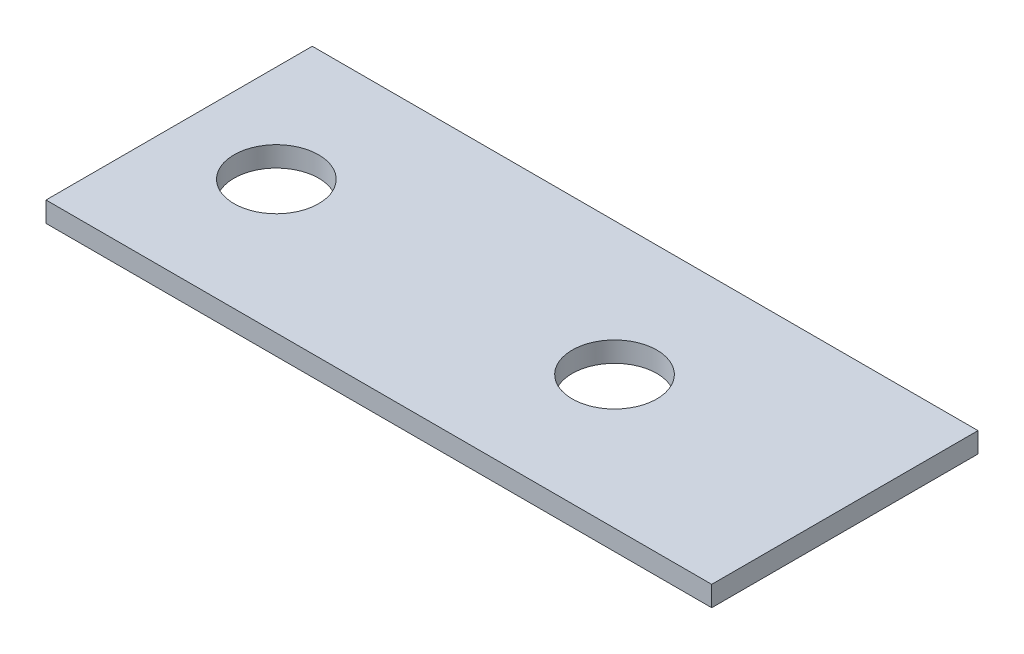
ISO-10303-21;
HEADER;
FILE_DESCRIPTION(('STEP AP214'),'2;1');
FILE_NAME('part.step','',(''),(''),'','','');
FILE_SCHEMA(('AUTOMOTIVE_DESIGN { 1 0 10303 214 1 1 1 1 }'));
ENDSEC;
DATA;
#1=APPLICATION_CONTEXT('core data for automotive mechanical design processes');
#2=APPLICATION_PROTOCOL_DEFINITION('international standard','automotive_design',2000,#1);
#3=PRODUCT_CONTEXT('',#1,'mechanical');
#4=PRODUCT('Part','Part','',(#3));
#5=PRODUCT_RELATED_PRODUCT_CATEGORY('part','',(#4));
#6=PRODUCT_DEFINITION_FORMATION('','',#4);
#7=PRODUCT_DEFINITION_CONTEXT('part definition',#1,'design');
#8=PRODUCT_DEFINITION('design','',#6,#7);
#9=PRODUCT_DEFINITION_SHAPE('','',#8);
#10=(LENGTH_UNIT() NAMED_UNIT(*) SI_UNIT(.MILLI.,.METRE.));
#11=(NAMED_UNIT(*) PLANE_ANGLE_UNIT() SI_UNIT($,.RADIAN.));
#12=(NAMED_UNIT(*) SI_UNIT($,.STERADIAN.) SOLID_ANGLE_UNIT());
#13=UNCERTAINTY_MEASURE_WITH_UNIT(LENGTH_MEASURE(1.E-05),#10,'distance_accuracy_value','');
#14=(GEOMETRIC_REPRESENTATION_CONTEXT(3) GLOBAL_UNCERTAINTY_ASSIGNED_CONTEXT((#13)) GLOBAL_UNIT_ASSIGNED_CONTEXT((#10,
#11,#12)) REPRESENTATION_CONTEXT('',''));
#15=CARTESIAN_POINT('',(0.,0.,0.));
#16=DIRECTION('',(0.,0.,1.));
#17=DIRECTION('',(1.,0.,0.));
#18=AXIS2_PLACEMENT_3D('',#15,#16,#17);
#19=CARTESIAN_POINT('',(21.35,0.762,0.));
#20=DIRECTION('',(1.,0.,0.));
#21=DIRECTION('',(0.,0.,-1.));
#22=AXIS2_PLACEMENT_3D('',#19,#20,#21);
#23=PLANE('',#22);
#24=DIRECTION('',(0.,0.,1.));
#25=VECTOR('',#24,1.);
#26=CARTESIAN_POINT('',(21.35,0.,0.));
#27=LINE('',#26,#25);
#28=CARTESIAN_POINT('',(21.35,0.,-5.));
#29=VERTEX_POINT('',#28);
#30=CARTESIAN_POINT('',(21.35,0.,5.));
#31=VERTEX_POINT('',#30);
#32=EDGE_CURVE('E113',#29,#31,#27,.T.);
#33=ORIENTED_EDGE('',*,*,#32,.F.);
#34=DIRECTION('',(0.,-1.,0.));
#35=VECTOR('',#34,1.);
#36=CARTESIAN_POINT('',(21.35,0.762,-5.));
#37=LINE('',#36,#35);
#38=CARTESIAN_POINT('',(21.35,0.762,-5.));
#39=VERTEX_POINT('',#38);
#40=EDGE_CURVE('E11',#39,#29,#37,.T.);
#41=ORIENTED_EDGE('',*,*,#40,.F.);
#42=DIRECTION('',(0.,0.,1.));
#43=VECTOR('',#42,1.);
#44=CARTESIAN_POINT('',(21.35,0.762,0.));
#45=LINE('',#44,#43);
#46=CARTESIAN_POINT('',(21.35,0.762,5.));
#47=VERTEX_POINT('',#46);
#48=EDGE_CURVE('E101',#39,#47,#45,.T.);
#49=ORIENTED_EDGE('',*,*,#48,.T.);
#50=DIRECTION('',(0.,-1.,0.));
#51=VECTOR('',#50,1.);
#52=CARTESIAN_POINT('',(21.35,0.762,5.));
#53=LINE('',#52,#51);
#54=EDGE_CURVE('E81',#47,#31,#53,.T.);
#55=ORIENTED_EDGE('',*,*,#54,.T.);
#56=EDGE_LOOP('',(#33,#41,#49,#55));
#57=FACE_BOUND('',#56,.T.);
#58=ADVANCED_FACE('F43',(#57),#23,.T.);
#59=CARTESIAN_POINT('',(0.,0.762,-5.));
#60=DIRECTION('',(0.,0.,-1.));
#61=DIRECTION('',(-1.,0.,0.));
#62=AXIS2_PLACEMENT_3D('',#59,#60,#61);
#63=PLANE('',#62);
#64=DIRECTION('',(1.,0.,0.));
#65=VECTOR('',#64,1.);
#66=CARTESIAN_POINT('',(0.,0.,-5.));
#67=LINE('',#66,#65);
#68=CARTESIAN_POINT('',(-3.65,0.,-5.));
#69=VERTEX_POINT('',#68);
#70=EDGE_CURVE('E94',#69,#29,#67,.T.);
#71=ORIENTED_EDGE('',*,*,#70,.F.);
#72=DIRECTION('',(0.,-1.,0.));
#73=VECTOR('',#72,1.);
#74=CARTESIAN_POINT('',(-3.65,0.762,-5.));
#75=LINE('',#74,#73);
#76=CARTESIAN_POINT('',(-3.65,0.762,-5.));
#77=VERTEX_POINT('',#76);
#78=EDGE_CURVE('E51',#77,#69,#75,.T.);
#79=ORIENTED_EDGE('',*,*,#78,.F.);
#80=DIRECTION('',(1.,0.,0.));
#81=VECTOR('',#80,1.);
#82=CARTESIAN_POINT('',(0.,0.762,-5.));
#83=LINE('',#82,#81);
#84=EDGE_CURVE('E92',#77,#39,#83,.T.);
#85=ORIENTED_EDGE('',*,*,#84,.T.);
#86=ORIENTED_EDGE('',*,*,#40,.T.);
#87=EDGE_LOOP('',(#71,#79,#85,#86));
#88=FACE_BOUND('',#87,.T.);
#89=ADVANCED_FACE('F90',(#88),#63,.T.);
#90=CARTESIAN_POINT('',(-3.65,0.762,0.));
#91=DIRECTION('',(1.,0.,0.));
#92=DIRECTION('',(0.,0.,-1.));
#93=AXIS2_PLACEMENT_3D('',#90,#91,#92);
#94=PLANE('',#93);
#95=DIRECTION('',(0.,0.,1.));
#96=VECTOR('',#95,1.);
#97=CARTESIAN_POINT('',(-3.65,0.,0.));
#98=LINE('',#97,#96);
#99=CARTESIAN_POINT('',(-3.65,0.,5.));
#100=VERTEX_POINT('',#99);
#101=EDGE_CURVE('E74',#69,#100,#98,.T.);
#102=ORIENTED_EDGE('',*,*,#101,.T.);
#103=DIRECTION('',(0.,-1.,0.));
#104=VECTOR('',#103,1.);
#105=CARTESIAN_POINT('',(-3.65,0.762,5.));
#106=LINE('',#105,#104);
#107=CARTESIAN_POINT('',(-3.65,0.762,5.));
#108=VERTEX_POINT('',#107);
#109=EDGE_CURVE('E95',#108,#100,#106,.T.);
#110=ORIENTED_EDGE('',*,*,#109,.F.);
#111=DIRECTION('',(0.,0.,1.));
#112=VECTOR('',#111,1.);
#113=CARTESIAN_POINT('',(-3.65,0.762,0.));
#114=LINE('',#113,#112);
#115=EDGE_CURVE('E96',#77,#108,#114,.T.);
#116=ORIENTED_EDGE('',*,*,#115,.F.);
#117=ORIENTED_EDGE('',*,*,#78,.T.);
#118=EDGE_LOOP('',(#102,#110,#116,#117));
#119=FACE_BOUND('',#118,.T.);
#120=ADVANCED_FACE('F97',(#119),#94,.F.);
#121=CARTESIAN_POINT('',(12.7,0.762,0.));
#122=DIRECTION('',(0.,-1.,0.));
#123=DIRECTION('',(0.,0.,-1.));
#124=AXIS2_PLACEMENT_3D('',#121,#122,#123);
#125=CYLINDRICAL_SURFACE('',#124,1.59);
#126=CARTESIAN_POINT('',(12.7,0.762,0.));
#127=DIRECTION('',(0.,1.,0.));
#128=DIRECTION('',(0.,0.,1.));
#129=AXIS2_PLACEMENT_3D('',#126,#127,#128);
#130=CIRCLE('',#129,1.59);
#131=CARTESIAN_POINT('',(12.7,0.762,-1.59));
#132=VERTEX_POINT('',#131);
#133=EDGE_CURVE('E107',#132,#132,#130,.T.);
#134=CARTESIAN_POINT('',(12.7,0.,0.));
#135=DIRECTION('',(0.,1.,0.));
#136=DIRECTION('',(0.,0.,1.));
#137=AXIS2_PLACEMENT_3D('',#134,#135,#136);
#138=CIRCLE('',#137,1.59);
#139=CARTESIAN_POINT('',(12.7,0.,-1.59));
#140=VERTEX_POINT('',#139);
#141=EDGE_CURVE('E120',#140,#140,#138,.T.);
#142=CARTESIAN_POINT('',(12.7,0.762,-1.59));
#143=CARTESIAN_POINT('',(12.7,0.7540625,-1.59));
#144=CARTESIAN_POINT('',(12.7,0.746125,-1.59));
#145=CARTESIAN_POINT('',(12.7,0.73025,-1.59));
#146=CARTESIAN_POINT('',(12.7,0.7223125,-1.59));
#147=CARTESIAN_POINT('',(12.7,0.7064375,-1.59));
#148=CARTESIAN_POINT('',(12.7,0.6985,-1.59));
#149=CARTESIAN_POINT('',(12.7,0.682625,-1.59));
#150=CARTESIAN_POINT('',(12.7,0.6746875,-1.59));
#151=CARTESIAN_POINT('',(12.7,0.6588125,-1.59));
#152=CARTESIAN_POINT('',(12.7,0.650875,-1.59));
#153=CARTESIAN_POINT('',(12.7,0.635,-1.59));
#154=CARTESIAN_POINT('',(12.7,0.6270625,-1.59));
#155=CARTESIAN_POINT('',(12.7,0.6111875,-1.59));
#156=CARTESIAN_POINT('',(12.7,0.60325,-1.59));
#157=CARTESIAN_POINT('',(12.7,0.587375,-1.59));
#158=CARTESIAN_POINT('',(12.7,0.5794375,-1.59));
#159=CARTESIAN_POINT('',(12.7,0.5635625,-1.59));
#160=CARTESIAN_POINT('',(12.7,0.555625,-1.59));
#161=CARTESIAN_POINT('',(12.7,0.53975,-1.59));
#162=CARTESIAN_POINT('',(12.7,0.5318125,-1.59));
#163=CARTESIAN_POINT('',(12.7,0.5159375,-1.59));
#164=CARTESIAN_POINT('',(12.7,0.508,-1.59));
#165=CARTESIAN_POINT('',(12.7,0.492125,-1.59));
#166=CARTESIAN_POINT('',(12.7,0.4841875,-1.59));
#167=CARTESIAN_POINT('',(12.7,0.4683125,-1.59));
#168=CARTESIAN_POINT('',(12.7,0.460375,-1.59));
#169=CARTESIAN_POINT('',(12.7,0.4445,-1.59));
#170=CARTESIAN_POINT('',(12.7,0.4365625,-1.59));
#171=CARTESIAN_POINT('',(12.7,0.4206875,-1.59));
#172=CARTESIAN_POINT('',(12.7,0.41275,-1.59));
#173=CARTESIAN_POINT('',(12.7,0.396875,-1.59));
#174=CARTESIAN_POINT('',(12.7,0.3889375,-1.59));
#175=CARTESIAN_POINT('',(12.7,0.3730625,-1.59));
#176=CARTESIAN_POINT('',(12.7,0.365125,-1.59));
#177=CARTESIAN_POINT('',(12.7,0.34925,-1.59));
#178=CARTESIAN_POINT('',(12.7,0.3413125,-1.59));
#179=CARTESIAN_POINT('',(12.7,0.3254375,-1.59));
#180=CARTESIAN_POINT('',(12.7,0.3175,-1.59));
#181=CARTESIAN_POINT('',(12.7,0.301625,-1.59));
#182=CARTESIAN_POINT('',(12.7,0.2936875,-1.59));
#183=CARTESIAN_POINT('',(12.7,0.2778125,-1.59));
#184=CARTESIAN_POINT('',(12.7,0.269875,-1.59));
#185=CARTESIAN_POINT('',(12.7,0.254,-1.59));
#186=CARTESIAN_POINT('',(12.7,0.2460625,-1.59));
#187=CARTESIAN_POINT('',(12.7,0.2301875,-1.59));
#188=CARTESIAN_POINT('',(12.7,0.22225,-1.59));
#189=CARTESIAN_POINT('',(12.7,0.206375,-1.59));
#190=CARTESIAN_POINT('',(12.7,0.1984375,-1.59));
#191=CARTESIAN_POINT('',(12.7,0.1825625,-1.59));
#192=CARTESIAN_POINT('',(12.7,0.174625,-1.59));
#193=CARTESIAN_POINT('',(12.7,0.15875,-1.59));
#194=CARTESIAN_POINT('',(12.7,0.1508125,-1.59));
#195=CARTESIAN_POINT('',(12.7,0.1349375,-1.59));
#196=CARTESIAN_POINT('',(12.7,0.127,-1.59));
#197=CARTESIAN_POINT('',(12.7,0.111125,-1.59));
#198=CARTESIAN_POINT('',(12.7,0.1031875,-1.59));
#199=CARTESIAN_POINT('',(12.7,0.0873125,-1.59));
#200=CARTESIAN_POINT('',(12.7,0.079375,-1.59));
#201=CARTESIAN_POINT('',(12.7,0.0635,-1.59));
#202=CARTESIAN_POINT('',(12.7,0.0555625,-1.59));
#203=CARTESIAN_POINT('',(12.7,0.0396875,-1.59));
#204=CARTESIAN_POINT('',(12.7,0.03175,-1.59));
#205=CARTESIAN_POINT('',(12.7,0.015875,-1.59));
#206=CARTESIAN_POINT('',(12.7,0.00793749999999999,-1.59));
#207=CARTESIAN_POINT('',(12.7,0.,-1.59));
#208=B_SPLINE_CURVE_WITH_KNOTS('',3,(#142,#143,#144,#145,#146,#147,#148,#149,#150,#151,#152,
#153,#154,#155,#156,#157,#158,#159,#160,#161,#162,#163,#164,#165,#166,#167,#168,#169,#170,#171,
#172,#173,#174,#175,#176,#177,#178,#179,#180,#181,#182,#183,#184,#185,#186,#187,#188,#189,#190,
#191,#192,#193,#194,#195,#196,#197,#198,#199,#200,#201,#202,#203,#204,#205,#206,#207),
.UNSPECIFIED.,.F.,.F.,(4,2,2,2,2,2,2,2,2,2,2,2,2,2,2,2,2,2,2,2,2,2,2,2,2,2,2,2,2,2,2,2,4),(0.,
0.0238125000000001,0.047625,0.0714375,0.0952500000000001,0.1190625,0.142875,0.1666875,0.1905,
0.2143125,0.238125,0.2619375,0.28575,0.3095625,0.333375,0.3571875,0.381,0.4048125,0.428625,
0.4524375,0.47625,0.5000625,0.523875,0.5476875,0.5715,0.5953125,0.619125,0.6429375,0.66675,
0.6905625,0.714375,0.7381875,0.762),.UNSPECIFIED.);
#209=EDGE_CURVE('BSEAM139',#132,#140,#208,.T.);
#210=ORIENTED_EDGE('',*,*,#133,.T.);
#211=ORIENTED_EDGE('',*,*,#141,.F.);
#212=ORIENTED_EDGE('',*,*,#209,.T.);
#213=ORIENTED_EDGE('',*,*,#209,.F.);
#214=EDGE_LOOP('',(#210,#212,#211,#213));
#215=FACE_BOUND('',#214,.T.);
#216=ADVANCED_FACE('F139',(#215),#125,.F.);
#217=CARTESIAN_POINT('',(0.,0.762,5.));
#218=DIRECTION('',(0.,0.,-1.));
#219=DIRECTION('',(-1.,0.,0.));
#220=AXIS2_PLACEMENT_3D('',#217,#218,#219);
#221=PLANE('',#220);
#222=DIRECTION('',(1.,0.,0.));
#223=VECTOR('',#222,1.);
#224=CARTESIAN_POINT('',(0.,0.,5.));
#225=LINE('',#224,#223);
#226=EDGE_CURVE('E118',#100,#31,#225,.T.);
#227=ORIENTED_EDGE('',*,*,#226,.T.);
#228=ORIENTED_EDGE('',*,*,#54,.F.);
#229=DIRECTION('',(1.,0.,0.));
#230=VECTOR('',#229,1.);
#231=CARTESIAN_POINT('',(0.,0.762,5.));
#232=LINE('',#231,#230);
#233=EDGE_CURVE('E59',#108,#47,#232,.T.);
#234=ORIENTED_EDGE('',*,*,#233,.F.);
#235=ORIENTED_EDGE('',*,*,#109,.T.);
#236=EDGE_LOOP('',(#227,#228,#234,#235));
#237=FACE_BOUND('',#236,.T.);
#238=ADVANCED_FACE('F128',(#237),#221,.F.);
#239=CARTESIAN_POINT('',(0.,0.762,0.));
#240=DIRECTION('',(0.,-1.,0.));
#241=DIRECTION('',(0.,0.,-1.));
#242=AXIS2_PLACEMENT_3D('',#239,#240,#241);
#243=CYLINDRICAL_SURFACE('',#242,1.59);
#244=CARTESIAN_POINT('',(0.,0.762,0.));
#245=DIRECTION('',(0.,1.,0.));
#246=DIRECTION('',(0.,0.,1.));
#247=AXIS2_PLACEMENT_3D('',#244,#245,#246);
#248=CIRCLE('',#247,1.59);
#249=CARTESIAN_POINT('',(0.,0.762,-1.59));
#250=VERTEX_POINT('',#249);
#251=EDGE_CURVE('E110',#250,#250,#248,.T.);
#252=CARTESIAN_POINT('',(0.,0.,0.));
#253=DIRECTION('',(0.,1.,0.));
#254=DIRECTION('',(0.,0.,1.));
#255=AXIS2_PLACEMENT_3D('',#252,#253,#254);
#256=CIRCLE('',#255,1.59);
#257=CARTESIAN_POINT('',(0.,0.,-1.59));
#258=VERTEX_POINT('',#257);
#259=EDGE_CURVE('E103',#258,#258,#256,.T.);
#260=CARTESIAN_POINT('',(0.,0.762,-1.59));
#261=CARTESIAN_POINT('',(0.,0.7540625,-1.59));
#262=CARTESIAN_POINT('',(0.,0.746125,-1.59));
#263=CARTESIAN_POINT('',(0.,0.73025,-1.59));
#264=CARTESIAN_POINT('',(0.,0.7223125,-1.59));
#265=CARTESIAN_POINT('',(0.,0.7064375,-1.59));
#266=CARTESIAN_POINT('',(0.,0.6985,-1.59));
#267=CARTESIAN_POINT('',(0.,0.682625,-1.59));
#268=CARTESIAN_POINT('',(0.,0.6746875,-1.59));
#269=CARTESIAN_POINT('',(0.,0.6588125,-1.59));
#270=CARTESIAN_POINT('',(0.,0.650875,-1.59));
#271=CARTESIAN_POINT('',(0.,0.635,-1.59));
#272=CARTESIAN_POINT('',(0.,0.6270625,-1.59));
#273=CARTESIAN_POINT('',(0.,0.6111875,-1.59));
#274=CARTESIAN_POINT('',(0.,0.60325,-1.59));
#275=CARTESIAN_POINT('',(0.,0.587375,-1.59));
#276=CARTESIAN_POINT('',(0.,0.5794375,-1.59));
#277=CARTESIAN_POINT('',(0.,0.5635625,-1.59));
#278=CARTESIAN_POINT('',(0.,0.555625,-1.59));
#279=CARTESIAN_POINT('',(0.,0.53975,-1.59));
#280=CARTESIAN_POINT('',(0.,0.5318125,-1.59));
#281=CARTESIAN_POINT('',(0.,0.5159375,-1.59));
#282=CARTESIAN_POINT('',(0.,0.508,-1.59));
#283=CARTESIAN_POINT('',(0.,0.492125,-1.59));
#284=CARTESIAN_POINT('',(0.,0.4841875,-1.59));
#285=CARTESIAN_POINT('',(0.,0.4683125,-1.59));
#286=CARTESIAN_POINT('',(0.,0.460375,-1.59));
#287=CARTESIAN_POINT('',(0.,0.4445,-1.59));
#288=CARTESIAN_POINT('',(0.,0.4365625,-1.59));
#289=CARTESIAN_POINT('',(0.,0.4206875,-1.59));
#290=CARTESIAN_POINT('',(0.,0.41275,-1.59));
#291=CARTESIAN_POINT('',(0.,0.396875,-1.59));
#292=CARTESIAN_POINT('',(0.,0.3889375,-1.59));
#293=CARTESIAN_POINT('',(0.,0.3730625,-1.59));
#294=CARTESIAN_POINT('',(0.,0.365125,-1.59));
#295=CARTESIAN_POINT('',(0.,0.34925,-1.59));
#296=CARTESIAN_POINT('',(0.,0.3413125,-1.59));
#297=CARTESIAN_POINT('',(0.,0.3254375,-1.59));
#298=CARTESIAN_POINT('',(0.,0.3175,-1.59));
#299=CARTESIAN_POINT('',(0.,0.301625,-1.59));
#300=CARTESIAN_POINT('',(0.,0.2936875,-1.59));
#301=CARTESIAN_POINT('',(0.,0.2778125,-1.59));
#302=CARTESIAN_POINT('',(0.,0.269875,-1.59));
#303=CARTESIAN_POINT('',(0.,0.254,-1.59));
#304=CARTESIAN_POINT('',(0.,0.2460625,-1.59));
#305=CARTESIAN_POINT('',(0.,0.2301875,-1.59));
#306=CARTESIAN_POINT('',(0.,0.22225,-1.59));
#307=CARTESIAN_POINT('',(0.,0.206375,-1.59));
#308=CARTESIAN_POINT('',(0.,0.1984375,-1.59));
#309=CARTESIAN_POINT('',(0.,0.1825625,-1.59));
#310=CARTESIAN_POINT('',(0.,0.174625,-1.59));
#311=CARTESIAN_POINT('',(0.,0.15875,-1.59));
#312=CARTESIAN_POINT('',(0.,0.1508125,-1.59));
#313=CARTESIAN_POINT('',(0.,0.1349375,-1.59));
#314=CARTESIAN_POINT('',(0.,0.127,-1.59));
#315=CARTESIAN_POINT('',(0.,0.111125,-1.59));
#316=CARTESIAN_POINT('',(0.,0.1031875,-1.59));
#317=CARTESIAN_POINT('',(0.,0.0873125,-1.59));
#318=CARTESIAN_POINT('',(0.,0.079375,-1.59));
#319=CARTESIAN_POINT('',(0.,0.0635,-1.59));
#320=CARTESIAN_POINT('',(0.,0.0555625,-1.59));
#321=CARTESIAN_POINT('',(0.,0.0396875,-1.59));
#322=CARTESIAN_POINT('',(0.,0.03175,-1.59));
#323=CARTESIAN_POINT('',(0.,0.015875,-1.59));
#324=CARTESIAN_POINT('',(0.,0.00793749999999999,-1.59));
#325=CARTESIAN_POINT('',(0.,0.,-1.59));
#326=B_SPLINE_CURVE_WITH_KNOTS('',3,(#260,#261,#262,#263,#264,#265,#266,#267,#268,#269,#270,
#271,#272,#273,#274,#275,#276,#277,#278,#279,#280,#281,#282,#283,#284,#285,#286,#287,#288,#289,
#290,#291,#292,#293,#294,#295,#296,#297,#298,#299,#300,#301,#302,#303,#304,#305,#306,#307,#308,
#309,#310,#311,#312,#313,#314,#315,#316,#317,#318,#319,#320,#321,#322,#323,#324,#325),
.UNSPECIFIED.,.F.,.F.,(4,2,2,2,2,2,2,2,2,2,2,2,2,2,2,2,2,2,2,2,2,2,2,2,2,2,2,2,2,2,2,2,4),(0.,
0.0238125000000001,0.047625,0.0714375,0.0952500000000001,0.1190625,0.142875,0.1666875,0.1905,
0.2143125,0.238125,0.2619375,0.28575,0.3095625,0.333375,0.3571875,0.381,0.4048125,0.428625,
0.4524375,0.47625,0.5000625,0.523875,0.5476875,0.5715,0.5953125,0.619125,0.6429375,0.66675,
0.6905625,0.714375,0.7381875,0.762),.UNSPECIFIED.);
#327=EDGE_CURVE('BSEAM144',#250,#258,#326,.T.);
#328=ORIENTED_EDGE('',*,*,#251,.T.);
#329=ORIENTED_EDGE('',*,*,#259,.F.);
#330=ORIENTED_EDGE('',*,*,#327,.T.);
#331=ORIENTED_EDGE('',*,*,#327,.F.);
#332=EDGE_LOOP('',(#328,#330,#329,#331));
#333=FACE_BOUND('',#332,.T.);
#334=ADVANCED_FACE('F144',(#333),#243,.F.);
#335=CARTESIAN_POINT('',(0.,0.762,0.));
#336=DIRECTION('',(0.,1.,0.));
#337=DIRECTION('',(0.,0.,1.));
#338=AXIS2_PLACEMENT_3D('',#335,#336,#337);
#339=PLANE('',#338);
#340=ORIENTED_EDGE('',*,*,#48,.F.);
#341=ORIENTED_EDGE('',*,*,#84,.F.);
#342=ORIENTED_EDGE('',*,*,#115,.T.);
#343=ORIENTED_EDGE('',*,*,#233,.T.);
#344=EDGE_LOOP('',(#340,#341,#342,#343));
#345=FACE_BOUND('',#344,.T.);
#346=ORIENTED_EDGE('',*,*,#133,.F.);
#347=EDGE_LOOP('',(#346));
#348=FACE_BOUND('',#347,.T.);
#349=ORIENTED_EDGE('',*,*,#251,.F.);
#350=EDGE_LOOP('',(#349));
#351=FACE_BOUND('',#350,.T.);
#352=ADVANCED_FACE('F99',(#345,#348,#351),#339,.T.);
#353=CARTESIAN_POINT('',(0.,0.,0.));
#354=DIRECTION('',(0.,1.,0.));
#355=DIRECTION('',(0.,0.,1.));
#356=AXIS2_PLACEMENT_3D('',#353,#354,#355);
#357=PLANE('',#356);
#358=ORIENTED_EDGE('',*,*,#32,.T.);
#359=ORIENTED_EDGE('',*,*,#226,.F.);
#360=ORIENTED_EDGE('',*,*,#101,.F.);
#361=ORIENTED_EDGE('',*,*,#70,.T.);
#362=EDGE_LOOP('',(#358,#359,#360,#361));
#363=FACE_BOUND('',#362,.T.);
#364=ORIENTED_EDGE('',*,*,#141,.T.);
#365=EDGE_LOOP('',(#364));
#366=FACE_BOUND('',#365,.T.);
#367=ORIENTED_EDGE('',*,*,#259,.T.);
#368=EDGE_LOOP('',(#367));
#369=FACE_BOUND('',#368,.T.);
#370=ADVANCED_FACE('F130',(#363,#366,#369),#357,.F.);
#371=CLOSED_SHELL('',(#58,#89,#120,#216,#238,#334,#352,#370));
#372=MANIFOLD_SOLID_BREP('B2',#371);
#373=ADVANCED_BREP_SHAPE_REPRESENTATION('',(#18,#372),#14);
#374=SHAPE_DEFINITION_REPRESENTATION(#9,#373);
ENDSEC;
END-ISO-10303-21;
